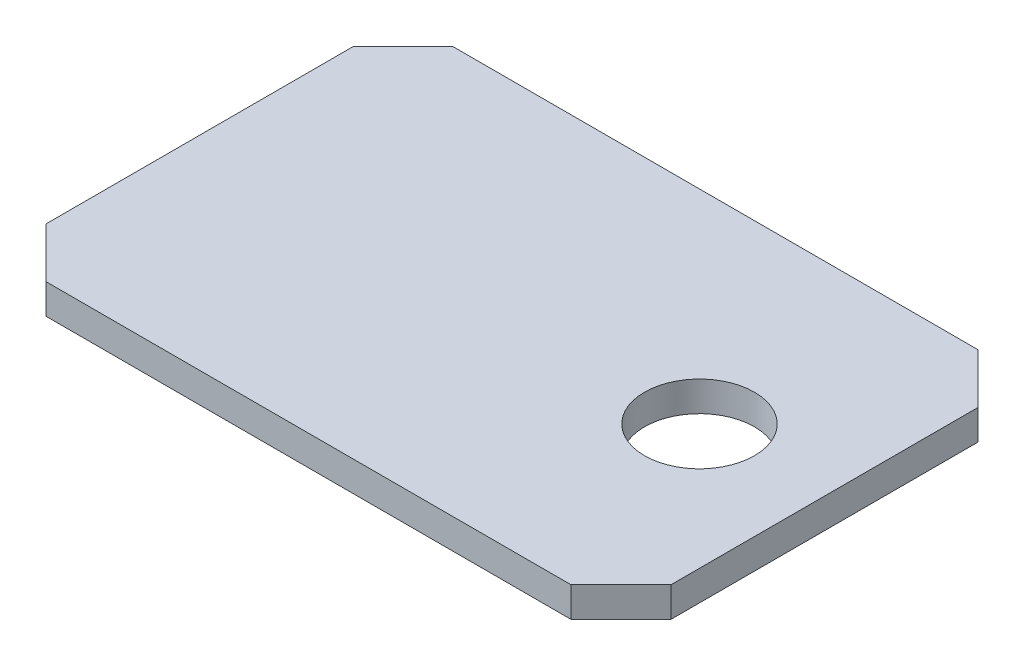
ISO-10303-21;
HEADER;
FILE_DESCRIPTION(('STEP AP214'),'2;1');
FILE_NAME('part.step','',(''),(''),'','','');
FILE_SCHEMA(('AUTOMOTIVE_DESIGN { 1 0 10303 214 1 1 1 1 }'));
ENDSEC;
DATA;
#1=APPLICATION_CONTEXT('core data for automotive mechanical design processes');
#2=APPLICATION_PROTOCOL_DEFINITION('international standard','automotive_design',2000,#1);
#3=PRODUCT_CONTEXT('',#1,'mechanical');
#4=PRODUCT('Part','Part','',(#3));
#5=PRODUCT_RELATED_PRODUCT_CATEGORY('part','',(#4));
#6=PRODUCT_DEFINITION_FORMATION('','',#4);
#7=PRODUCT_DEFINITION_CONTEXT('part definition',#1,'design');
#8=PRODUCT_DEFINITION('design','',#6,#7);
#9=PRODUCT_DEFINITION_SHAPE('','',#8);
#10=(LENGTH_UNIT() NAMED_UNIT(*) SI_UNIT(.MILLI.,.METRE.));
#11=(NAMED_UNIT(*) PLANE_ANGLE_UNIT() SI_UNIT($,.RADIAN.));
#12=(NAMED_UNIT(*) SI_UNIT($,.STERADIAN.) SOLID_ANGLE_UNIT());
#13=UNCERTAINTY_MEASURE_WITH_UNIT(LENGTH_MEASURE(1.E-05),#10,'distance_accuracy_value','');
#14=(GEOMETRIC_REPRESENTATION_CONTEXT(3) GLOBAL_UNCERTAINTY_ASSIGNED_CONTEXT((#13)) GLOBAL_UNIT_ASSIGNED_CONTEXT((#10,
#11,#12)) REPRESENTATION_CONTEXT('',''));
#15=CARTESIAN_POINT('',(0.,0.,0.));
#16=DIRECTION('',(0.,0.,1.));
#17=DIRECTION('',(1.,0.,0.));
#18=AXIS2_PLACEMENT_3D('',#15,#16,#17);
#19=CARTESIAN_POINT('',(85.,344.,-307.226216017293));
#20=DIRECTION('',(1.,0.,0.));
#21=DIRECTION('',(0.,0.,-1.));
#22=AXIS2_PLACEMENT_3D('',#19,#20,#21);
#23=PLANE('',#22);
#24=DIRECTION('',(0.,0.,-1.));
#25=VECTOR('',#24,1.);
#26=CARTESIAN_POINT('',(85.,344.,-307.226216017293));
#27=LINE('',#26,#25);
#28=CARTESIAN_POINT('',(85.0000000000001,344.,-235.816275181612));
#29=VERTEX_POINT('',#28);
#30=CARTESIAN_POINT('',(85.,344.,-297.226216017293));
#31=VERTEX_POINT('',#30);
#32=EDGE_CURVE('E138',#29,#31,#27,.T.);
#33=ORIENTED_EDGE('',*,*,#32,.T.);
#34=DIRECTION('',(0.,1.,0.));
#35=VECTOR('',#34,1.);
#36=CARTESIAN_POINT('',(85.,344.,-297.226216017293));
#37=LINE('',#36,#35);
#38=CARTESIAN_POINT('',(85.0000000000001,350.,-297.226216017293));
#39=VERTEX_POINT('',#38);
#40=EDGE_CURVE('E181',#31,#39,#37,.T.);
#41=ORIENTED_EDGE('',*,*,#40,.T.);
#42=DIRECTION('',(0.,0.,-1.));
#43=VECTOR('',#42,1.);
#44=CARTESIAN_POINT('',(85.,350.,-307.226216017293));
#45=LINE('',#44,#43);
#46=CARTESIAN_POINT('',(85.0000000000001,350.,-235.816275181612));
#47=VERTEX_POINT('',#46);
#48=EDGE_CURVE('E187',#47,#39,#45,.T.);
#49=ORIENTED_EDGE('',*,*,#48,.F.);
#50=DIRECTION('',(0.,-1.,0.));
#51=VECTOR('',#50,1.);
#52=CARTESIAN_POINT('',(85.0000000000001,344.,-235.816275181612));
#53=LINE('',#52,#51);
#54=EDGE_CURVE('E147',#47,#29,#53,.T.);
#55=ORIENTED_EDGE('',*,*,#54,.T.);
#56=EDGE_LOOP('',(#33,#41,#49,#55));
#57=FACE_BOUND('',#56,.T.);
#58=ADVANCED_FACE('F67',(#57),#23,.T.);
#59=CARTESIAN_POINT('',(-39.9999999999999,344.,-225.816275181612));
#60=DIRECTION('',(0.,0.,1.));
#61=DIRECTION('',(1.,0.,0.));
#62=AXIS2_PLACEMENT_3D('',#59,#60,#61);
#63=PLANE('',#62);
#64=DIRECTION('',(1.,0.,0.));
#65=VECTOR('',#64,1.);
#66=CARTESIAN_POINT('',(-39.9999999999999,350.,-225.816275181612));
#67=LINE('',#66,#65);
#68=CARTESIAN_POINT('',(-29.9999999999999,350.,-225.816275181612));
#69=VERTEX_POINT('',#68);
#70=CARTESIAN_POINT('',(75.0000000000001,350.,-225.816275181612));
#71=VERTEX_POINT('',#70);
#72=EDGE_CURVE('E128',#69,#71,#67,.T.);
#73=ORIENTED_EDGE('',*,*,#72,.F.);
#74=DIRECTION('',(0.,-1.,0.));
#75=VECTOR('',#74,1.);
#76=CARTESIAN_POINT('',(-29.9999999999999,344.,-225.816275181612));
#77=LINE('',#76,#75);
#78=CARTESIAN_POINT('',(-29.9999999999999,344.,-225.816275181612));
#79=VERTEX_POINT('',#78);
#80=EDGE_CURVE('E166',#69,#79,#77,.T.);
#81=ORIENTED_EDGE('',*,*,#80,.T.);
#82=DIRECTION('',(1.,0.,0.));
#83=VECTOR('',#82,1.);
#84=CARTESIAN_POINT('',(-39.9999999999999,344.,-225.816275181612));
#85=LINE('',#84,#83);
#86=CARTESIAN_POINT('',(75.0000000000001,344.,-225.816275181612));
#87=VERTEX_POINT('',#86);
#88=EDGE_CURVE('E151',#79,#87,#85,.T.);
#89=ORIENTED_EDGE('',*,*,#88,.T.);
#90=DIRECTION('',(0.,1.,0.));
#91=VECTOR('',#90,1.);
#92=CARTESIAN_POINT('',(75.0000000000001,344.,-225.816275181612));
#93=LINE('',#92,#91);
#94=EDGE_CURVE('E146',#87,#71,#93,.T.);
#95=ORIENTED_EDGE('',*,*,#94,.T.);
#96=EDGE_LOOP('',(#73,#81,#89,#95));
#97=FACE_BOUND('',#96,.T.);
#98=ADVANCED_FACE('F149',(#97),#63,.T.);
#99=CARTESIAN_POINT('',(-40.,344.,-307.226216017293));
#100=DIRECTION('',(-1.,0.,0.));
#101=DIRECTION('',(0.,0.,1.));
#102=AXIS2_PLACEMENT_3D('',#99,#100,#101);
#103=PLANE('',#102);
#104=DIRECTION('',(0.,0.,1.));
#105=VECTOR('',#104,1.);
#106=CARTESIAN_POINT('',(-40.,350.,-307.226216017293));
#107=LINE('',#106,#105);
#108=CARTESIAN_POINT('',(-40.,350.,-297.226216017293));
#109=VERTEX_POINT('',#108);
#110=CARTESIAN_POINT('',(-40.,350.,-235.816275181612));
#111=VERTEX_POINT('',#110);
#112=EDGE_CURVE('E139',#109,#111,#107,.T.);
#113=ORIENTED_EDGE('',*,*,#112,.F.);
#114=DIRECTION('',(0.,-1.,0.));
#115=VECTOR('',#114,1.);
#116=CARTESIAN_POINT('',(-40.,344.,-297.226216017293));
#117=LINE('',#116,#115);
#118=CARTESIAN_POINT('',(-40.,344.,-297.226216017293));
#119=VERTEX_POINT('',#118);
#120=EDGE_CURVE('E176',#109,#119,#117,.T.);
#121=ORIENTED_EDGE('',*,*,#120,.T.);
#122=DIRECTION('',(0.,0.,1.));
#123=VECTOR('',#122,1.);
#124=CARTESIAN_POINT('',(-40.,344.,-307.226216017293));
#125=LINE('',#124,#123);
#126=CARTESIAN_POINT('',(-39.9999999999999,344.,-235.816275181612));
#127=VERTEX_POINT('',#126);
#128=EDGE_CURVE('E154',#119,#127,#125,.T.);
#129=ORIENTED_EDGE('',*,*,#128,.T.);
#130=DIRECTION('',(0.,1.,0.));
#131=VECTOR('',#130,1.);
#132=CARTESIAN_POINT('',(-39.9999999999999,344.,-235.816275181612));
#133=LINE('',#132,#131);
#134=EDGE_CURVE('E162',#127,#111,#133,.T.);
#135=ORIENTED_EDGE('',*,*,#134,.T.);
#136=EDGE_LOOP('',(#113,#121,#129,#135));
#137=FACE_BOUND('',#136,.T.);
#138=ADVANCED_FACE('F206',(#137),#103,.T.);
#139=CARTESIAN_POINT('',(-40.,344.,-307.226216017293));
#140=DIRECTION('',(0.,0.,-1.));
#141=DIRECTION('',(-1.,0.,0.));
#142=AXIS2_PLACEMENT_3D('',#139,#140,#141);
#143=PLANE('',#142);
#144=DIRECTION('',(-1.,0.,0.));
#145=VECTOR('',#144,1.);
#146=CARTESIAN_POINT('',(-40.,350.,-307.226216017293));
#147=LINE('',#146,#145);
#148=CARTESIAN_POINT('',(75.0000000000001,350.,-307.226216017293));
#149=VERTEX_POINT('',#148);
#150=CARTESIAN_POINT('',(-30.,350.,-307.226216017293));
#151=VERTEX_POINT('',#150);
#152=EDGE_CURVE('E191',#149,#151,#147,.T.);
#153=ORIENTED_EDGE('',*,*,#152,.F.);
#154=DIRECTION('',(0.,-1.,0.));
#155=VECTOR('',#154,1.);
#156=CARTESIAN_POINT('',(75.0000000000001,344.,-307.226216017293));
#157=LINE('',#156,#155);
#158=CARTESIAN_POINT('',(75.0000000000001,344.,-307.226216017293));
#159=VERTEX_POINT('',#158);
#160=EDGE_CURVE('E75',#149,#159,#157,.T.);
#161=ORIENTED_EDGE('',*,*,#160,.T.);
#162=DIRECTION('',(-1.,0.,0.));
#163=VECTOR('',#162,1.);
#164=CARTESIAN_POINT('',(-40.,344.,-307.226216017293));
#165=LINE('',#164,#163);
#166=CARTESIAN_POINT('',(-30.,344.,-307.226216017293));
#167=VERTEX_POINT('',#166);
#168=EDGE_CURVE('E210',#159,#167,#165,.T.);
#169=ORIENTED_EDGE('',*,*,#168,.T.);
#170=DIRECTION('',(0.,1.,0.));
#171=VECTOR('',#170,1.);
#172=CARTESIAN_POINT('',(-30.,344.,-307.226216017293));
#173=LINE('',#172,#171);
#174=EDGE_CURVE('E171',#167,#151,#173,.T.);
#175=ORIENTED_EDGE('',*,*,#174,.T.);
#176=EDGE_LOOP('',(#153,#161,#169,#175));
#177=FACE_BOUND('',#176,.T.);
#178=ADVANCED_FACE('F221',(#177),#143,.T.);
#179=CARTESIAN_POINT('',(0.,344.,0.));
#180=DIRECTION('',(0.,1.,0.));
#181=DIRECTION('',(0.,0.,1.));
#182=AXIS2_PLACEMENT_3D('',#179,#180,#181);
#183=PLANE('',#182);
#184=CARTESIAN_POINT('',(60.,344.,-266.521245599452));
#185=DIRECTION('',(0.,-1.,0.));
#186=DIRECTION('',(0.,0.,-1.));
#187=AXIS2_PLACEMENT_3D('',#184,#185,#186);
#188=CIRCLE('',#187,11.);
#189=CARTESIAN_POINT('',(60.,344.,-277.521245599452));
#190=VERTEX_POINT('',#189);
#191=EDGE_CURVE('E195',#190,#190,#188,.T.);
#192=ORIENTED_EDGE('',*,*,#191,.F.);
#193=EDGE_LOOP('',(#192));
#194=FACE_BOUND('',#193,.T.);
#195=ORIENTED_EDGE('',*,*,#168,.F.);
#196=DIRECTION('',(-0.707106781186547,0.,-0.707106781186548));
#197=VECTOR('',#196,1.);
#198=CARTESIAN_POINT('',(85.,344.,-297.226216017293));
#199=LINE('',#198,#197);
#200=EDGE_CURVE('E13',#159,#31,#199,.F.);
#201=ORIENTED_EDGE('',*,*,#200,.T.);
#202=ORIENTED_EDGE('',*,*,#32,.F.);
#203=DIRECTION('',(0.707106781186547,0.,-0.707106781186548));
#204=VECTOR('',#203,1.);
#205=CARTESIAN_POINT('',(75.0000000000001,344.,-225.816275181612));
#206=LINE('',#205,#204);
#207=EDGE_CURVE('E160',#29,#87,#206,.F.);
#208=ORIENTED_EDGE('',*,*,#207,.T.);
#209=ORIENTED_EDGE('',*,*,#88,.F.);
#210=DIRECTION('',(0.707106781186547,0.,0.707106781186548));
#211=VECTOR('',#210,1.);
#212=CARTESIAN_POINT('',(-39.9999999999999,344.,-235.816275181612));
#213=LINE('',#212,#211);
#214=EDGE_CURVE('E168',#79,#127,#213,.F.);
#215=ORIENTED_EDGE('',*,*,#214,.T.);
#216=ORIENTED_EDGE('',*,*,#128,.F.);
#217=DIRECTION('',(-0.707106781186547,0.,0.707106781186548));
#218=VECTOR('',#217,1.);
#219=CARTESIAN_POINT('',(-30.,344.,-307.226216017293));
#220=LINE('',#219,#218);
#221=EDGE_CURVE('E178',#119,#167,#220,.F.);
#222=ORIENTED_EDGE('',*,*,#221,.T.);
#223=EDGE_LOOP('',(#195,#201,#202,#208,#209,#215,#216,#222));
#224=FACE_BOUND('',#223,.T.);
#225=ADVANCED_FACE('F211',(#194,#224),#183,.F.);
#226=CARTESIAN_POINT('',(0.,350.,0.));
#227=DIRECTION('',(0.,1.,0.));
#228=DIRECTION('',(0.,0.,1.));
#229=AXIS2_PLACEMENT_3D('',#226,#227,#228);
#230=PLANE('',#229);
#231=CARTESIAN_POINT('',(60.,350.,-266.521245599452));
#232=DIRECTION('',(0.,1.,0.));
#233=DIRECTION('',(0.,0.,1.));
#234=AXIS2_PLACEMENT_3D('',#231,#232,#233);
#235=CIRCLE('',#234,11.);
#236=CARTESIAN_POINT('',(60.,350.,-255.521245599452));
#237=VERTEX_POINT('',#236);
#238=EDGE_CURVE('E157',#237,#237,#235,.T.);
#239=ORIENTED_EDGE('',*,*,#238,.F.);
#240=EDGE_LOOP('',(#239));
#241=FACE_BOUND('',#240,.T.);
#242=ORIENTED_EDGE('',*,*,#48,.T.);
#243=DIRECTION('',(0.707106781186547,0.,0.707106781186548));
#244=VECTOR('',#243,1.);
#245=CARTESIAN_POINT('',(191.113108008647,350.,-191.113108008646));
#246=LINE('',#245,#244);
#247=EDGE_CURVE('E89',#39,#149,#246,.F.);
#248=ORIENTED_EDGE('',*,*,#247,.T.);
#249=ORIENTED_EDGE('',*,*,#152,.T.);
#250=DIRECTION('',(0.707106781186547,0.,-0.707106781186548));
#251=VECTOR('',#250,1.);
#252=CARTESIAN_POINT('',(-168.613108008647,350.,-168.613108008646));
#253=LINE('',#252,#251);
#254=EDGE_CURVE('E174',#151,#109,#253,.F.);
#255=ORIENTED_EDGE('',*,*,#254,.T.);
#256=ORIENTED_EDGE('',*,*,#112,.T.);
#257=DIRECTION('',(-0.707106781186547,0.,-0.707106781186548));
#258=VECTOR('',#257,1.);
#259=CARTESIAN_POINT('',(97.9081375908059,350.,-97.9081375908058));
#260=LINE('',#259,#258);
#261=EDGE_CURVE('E134',#111,#69,#260,.F.);
#262=ORIENTED_EDGE('',*,*,#261,.T.);
#263=ORIENTED_EDGE('',*,*,#72,.T.);
#264=DIRECTION('',(-0.707106781186547,0.,0.707106781186548));
#265=VECTOR('',#264,1.);
#266=CARTESIAN_POINT('',(-75.4081375908058,350.,-75.4081375908057));
#267=LINE('',#266,#265);
#268=EDGE_CURVE('E131',#71,#47,#267,.F.);
#269=ORIENTED_EDGE('',*,*,#268,.T.);
#270=EDGE_LOOP('',(#242,#248,#249,#255,#256,#262,#263,#269));
#271=FACE_BOUND('',#270,.T.);
#272=ADVANCED_FACE('F130',(#241,#271),#230,.T.);
#273=CARTESIAN_POINT('',(60.,354.,-266.521245599452));
#274=DIRECTION('',(0.,-1.,0.));
#275=DIRECTION('',(0.,0.,-1.));
#276=AXIS2_PLACEMENT_3D('',#273,#274,#275);
#277=CYLINDRICAL_SURFACE('',#276,11.);
#278=ORIENTED_EDGE('',*,*,#238,.T.);
#279=EDGE_LOOP('',(#278));
#280=FACE_BOUND('',#279,.T.);
#281=ORIENTED_EDGE('',*,*,#191,.T.);
#282=EDGE_LOOP('',(#281));
#283=FACE_BOUND('',#282,.T.);
#284=ADVANCED_FACE('F218',(#280,#283),#277,.F.);
#285=CARTESIAN_POINT('',(75.0000000000001,344.,-225.816275181612));
#286=DIRECTION('',(-0.707106781186548,0.,-0.707106781186547));
#287=DIRECTION('',(0.,1.,0.));
#288=AXIS2_PLACEMENT_3D('',#285,#286,#287);
#289=PLANE('',#288);
#290=ORIENTED_EDGE('',*,*,#207,.F.);
#291=ORIENTED_EDGE('',*,*,#54,.F.);
#292=ORIENTED_EDGE('',*,*,#268,.F.);
#293=ORIENTED_EDGE('',*,*,#94,.F.);
#294=EDGE_LOOP('',(#290,#291,#292,#293));
#295=FACE_BOUND('',#294,.T.);
#296=ADVANCED_FACE('F145',(#295),#289,.F.);
#297=CARTESIAN_POINT('',(-39.9999999999999,344.,-235.816275181612));
#298=DIRECTION('',(0.707106781186548,0.,-0.707106781186547));
#299=DIRECTION('',(0.,1.,0.));
#300=AXIS2_PLACEMENT_3D('',#297,#298,#299);
#301=PLANE('',#300);
#302=ORIENTED_EDGE('',*,*,#214,.F.);
#303=ORIENTED_EDGE('',*,*,#80,.F.);
#304=ORIENTED_EDGE('',*,*,#261,.F.);
#305=ORIENTED_EDGE('',*,*,#134,.F.);
#306=EDGE_LOOP('',(#302,#303,#304,#305));
#307=FACE_BOUND('',#306,.T.);
#308=ADVANCED_FACE('F205',(#307),#301,.F.);
#309=CARTESIAN_POINT('',(-30.,344.,-307.226216017293));
#310=DIRECTION('',(0.707106781186548,0.,0.707106781186547));
#311=DIRECTION('',(0.,1.,0.));
#312=AXIS2_PLACEMENT_3D('',#309,#310,#311);
#313=PLANE('',#312);
#314=ORIENTED_EDGE('',*,*,#221,.F.);
#315=ORIENTED_EDGE('',*,*,#120,.F.);
#316=ORIENTED_EDGE('',*,*,#254,.F.);
#317=ORIENTED_EDGE('',*,*,#174,.F.);
#318=EDGE_LOOP('',(#314,#315,#316,#317));
#319=FACE_BOUND('',#318,.T.);
#320=ADVANCED_FACE('F242',(#319),#313,.F.);
#321=CARTESIAN_POINT('',(85.,344.,-297.226216017293));
#322=DIRECTION('',(-0.707106781186548,0.,0.707106781186547));
#323=DIRECTION('',(0.,1.,0.));
#324=AXIS2_PLACEMENT_3D('',#321,#322,#323);
#325=PLANE('',#324);
#326=ORIENTED_EDGE('',*,*,#200,.F.);
#327=ORIENTED_EDGE('',*,*,#160,.F.);
#328=ORIENTED_EDGE('',*,*,#247,.F.);
#329=ORIENTED_EDGE('',*,*,#40,.F.);
#330=EDGE_LOOP('',(#326,#327,#328,#329));
#331=FACE_BOUND('',#330,.T.);
#332=ADVANCED_FACE('F69',(#331),#325,.F.);
#333=CLOSED_SHELL('',(#58,#98,#138,#178,#225,#272,#284,#296,#308,#320,#332));
#334=MANIFOLD_SOLID_BREP('B2',#333);
#335=ADVANCED_BREP_SHAPE_REPRESENTATION('',(#18,#334),#14);
#336=SHAPE_DEFINITION_REPRESENTATION(#9,#335);
ENDSEC;
END-ISO-10303-21;
